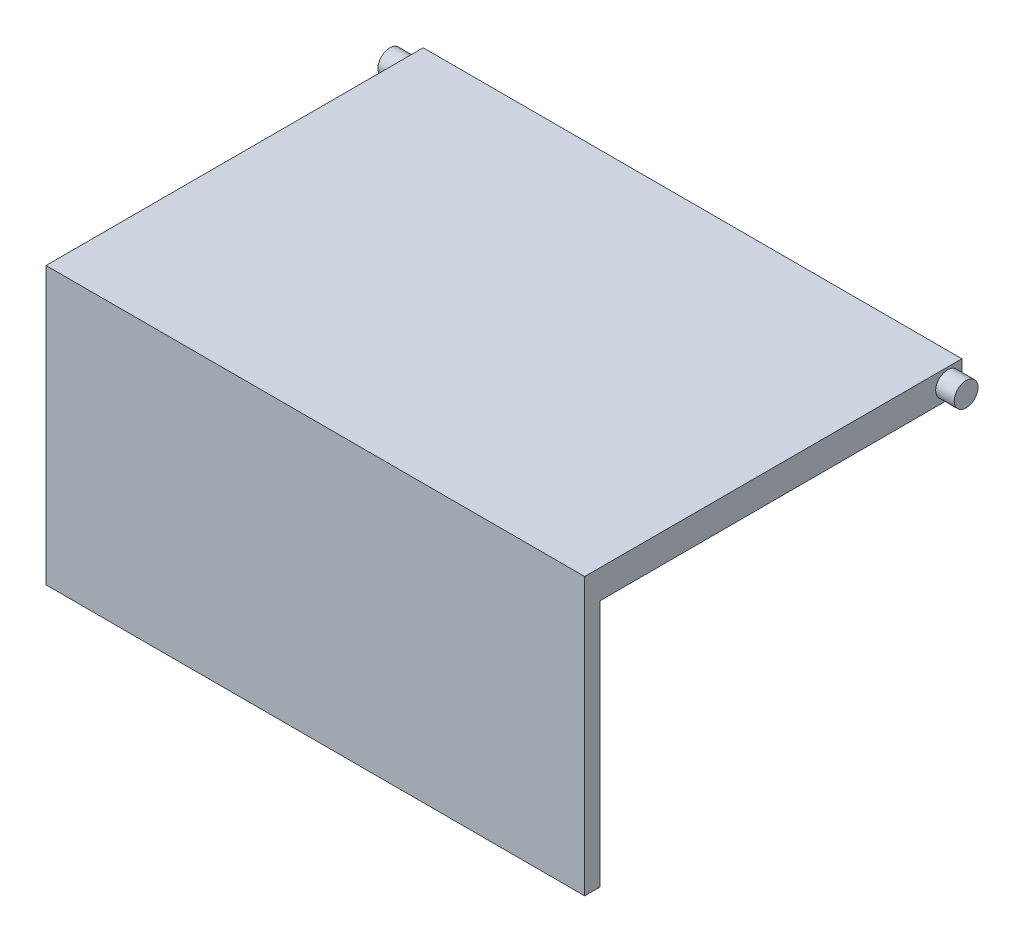
ISO-10303-21;
HEADER;
FILE_DESCRIPTION(('STEP AP214'),'2;1');
FILE_NAME('part.step','',(''),(''),'','','');
FILE_SCHEMA(('AUTOMOTIVE_DESIGN { 1 0 10303 214 1 1 1 1 }'));
ENDSEC;
DATA;
#1=APPLICATION_CONTEXT('core data for automotive mechanical design processes');
#2=APPLICATION_PROTOCOL_DEFINITION('international standard','automotive_design',2000,#1);
#3=PRODUCT_CONTEXT('',#1,'mechanical');
#4=PRODUCT('Part','Part','',(#3));
#5=PRODUCT_RELATED_PRODUCT_CATEGORY('part','',(#4));
#6=PRODUCT_DEFINITION_FORMATION('','',#4);
#7=PRODUCT_DEFINITION_CONTEXT('part definition',#1,'design');
#8=PRODUCT_DEFINITION('design','',#6,#7);
#9=PRODUCT_DEFINITION_SHAPE('','',#8);
#10=(LENGTH_UNIT() NAMED_UNIT(*) SI_UNIT(.MILLI.,.METRE.));
#11=(NAMED_UNIT(*) PLANE_ANGLE_UNIT() SI_UNIT($,.RADIAN.));
#12=(NAMED_UNIT(*) SI_UNIT($,.STERADIAN.) SOLID_ANGLE_UNIT());
#13=UNCERTAINTY_MEASURE_WITH_UNIT(LENGTH_MEASURE(1.E-05),#10,'distance_accuracy_value','');
#14=(GEOMETRIC_REPRESENTATION_CONTEXT(3) GLOBAL_UNCERTAINTY_ASSIGNED_CONTEXT((#13)) GLOBAL_UNIT_ASSIGNED_CONTEXT((#10,
#11,#12)) REPRESENTATION_CONTEXT('',''));
#15=CARTESIAN_POINT('',(0.,0.,0.));
#16=DIRECTION('',(0.,0.,1.));
#17=DIRECTION('',(1.,0.,0.));
#18=AXIS2_PLACEMENT_3D('',#15,#16,#17);
#19=CARTESIAN_POINT('',(-26.3692636072572,5.58057630736393,3.));
#20=DIRECTION('',(1.,0.,0.));
#21=DIRECTION('',(0.,0.,-1.));
#22=AXIS2_PLACEMENT_3D('',#19,#20,#21);
#23=CYLINDRICAL_SURFACE('',#22,2.5);
#24=CARTESIAN_POINT('',(94.6307363927428,5.58057630736393,3.));
#25=DIRECTION('',(-1.,0.,0.));
#26=DIRECTION('',(0.,0.,1.));
#27=AXIS2_PLACEMENT_3D('',#24,#25,#26);
#28=CIRCLE('',#27,2.5);
#29=CARTESIAN_POINT('',(94.6307363927428,5.58057630736393,5.5));
#30=VERTEX_POINT('',#29);
#31=EDGE_CURVE('E146',#30,#30,#28,.T.);
#32=ORIENTED_EDGE('',*,*,#31,.T.);
#33=EDGE_LOOP('',(#32));
#34=FACE_BOUND('',#33,.T.);
#35=CARTESIAN_POINT('',(90.7407363927428,5.58057630736393,3.));
#36=DIRECTION('',(-1.,0.,0.));
#37=DIRECTION('',(0.,0.,1.));
#38=AXIS2_PLACEMENT_3D('',#35,#36,#37);
#39=CIRCLE('',#38,2.5);
#40=CARTESIAN_POINT('',(90.7407363927428,5.58057630736393,5.5));
#41=VERTEX_POINT('',#40);
#42=EDGE_CURVE('E105',#41,#41,#39,.F.);
#43=ORIENTED_EDGE('',*,*,#42,.T.);
#44=EDGE_LOOP('',(#43));
#45=FACE_BOUND('',#44,.T.);
#46=ADVANCED_FACE('F37',(#34,#45),#23,.T.);
#47=CARTESIAN_POINT('',(-22.3692636072572,8.58057630736393,80.));
#48=DIRECTION('',(1.,0.,0.));
#49=DIRECTION('',(0.,0.,-1.));
#50=AXIS2_PLACEMENT_3D('',#47,#48,#49);
#51=PLANE('',#50);
#52=DIRECTION('',(0.,0.,-1.));
#53=VECTOR('',#52,1.);
#54=CARTESIAN_POINT('',(-22.3692636072572,-49.4894236926361,80.));
#55=LINE('',#54,#53);
#56=CARTESIAN_POINT('',(-22.3692636072572,-49.4894236926361,79.2));
#57=VERTEX_POINT('',#56);
#58=CARTESIAN_POINT('',(-22.3692636072572,-49.4894236926361,76.));
#59=VERTEX_POINT('',#58);
#60=EDGE_CURVE('E97',#57,#59,#55,.T.);
#61=ORIENTED_EDGE('',*,*,#60,.F.);
#62=DIRECTION('',(0.,-1.,0.));
#63=VECTOR('',#62,1.);
#64=CARTESIAN_POINT('',(-22.3692636072572,8.58057630736393,79.2));
#65=LINE('',#64,#63);
#66=CARTESIAN_POINT('',(-22.3692636072572,8.58057630736393,79.2));
#67=VERTEX_POINT('',#66);
#68=EDGE_CURVE('E51',#67,#57,#65,.T.);
#69=ORIENTED_EDGE('',*,*,#68,.F.);
#70=DIRECTION('',(0.,0.,-1.));
#71=VECTOR('',#70,1.);
#72=CARTESIAN_POINT('',(-22.3692636072572,8.58057630736393,80.));
#73=LINE('',#72,#71);
#74=CARTESIAN_POINT('',(-22.3692636072572,8.58057630736393,0.));
#75=VERTEX_POINT('',#74);
#76=EDGE_CURVE('E58',#67,#75,#73,.T.);
#77=ORIENTED_EDGE('',*,*,#76,.T.);
#78=DIRECTION('',(0.,-1.,0.));
#79=VECTOR('',#78,1.);
#80=CARTESIAN_POINT('',(-22.3692636072572,8.58057630736393,0.));
#81=LINE('',#80,#79);
#82=CARTESIAN_POINT('',(-22.3692636072572,2.56610996324618,0.));
#83=VERTEX_POINT('',#82);
#84=EDGE_CURVE('E134',#75,#83,#81,.T.);
#85=ORIENTED_EDGE('',*,*,#84,.T.);
#86=DIRECTION('',(0.,0.,-1.));
#87=VECTOR('',#86,1.);
#88=CARTESIAN_POINT('',(-22.3692636072572,2.56610996324618,79.));
#89=LINE('',#88,#87);
#90=CARTESIAN_POINT('',(-22.3692636072572,2.56610996324618,76.));
#91=VERTEX_POINT('',#90);
#92=EDGE_CURVE('E144',#91,#83,#89,.T.);
#93=ORIENTED_EDGE('',*,*,#92,.F.);
#94=DIRECTION('',(0.,1.,0.));
#95=VECTOR('',#94,1.);
#96=CARTESIAN_POINT('',(-22.3692636072572,-49.4894236926361,76.));
#97=LINE('',#96,#95);
#98=EDGE_CURVE('E121',#59,#91,#97,.T.);
#99=ORIENTED_EDGE('',*,*,#98,.F.);
#100=EDGE_LOOP('',(#61,#69,#77,#85,#93,#99));
#101=FACE_BOUND('',#100,.T.);
#102=CARTESIAN_POINT('',(-22.3692636072572,5.58057630736393,3.));
#103=DIRECTION('',(1.,0.,0.));
#104=DIRECTION('',(0.,0.,-1.));
#105=AXIS2_PLACEMENT_3D('',#102,#103,#104);
#106=CIRCLE('',#105,2.5);
#107=CARTESIAN_POINT('',(-22.3692636072572,5.58057630736393,0.5));
#108=VERTEX_POINT('',#107);
#109=EDGE_CURVE('E157',#108,#108,#106,.F.);
#110=ORIENTED_EDGE('',*,*,#109,.F.);
#111=EDGE_LOOP('',(#110));
#112=FACE_BOUND('',#111,.T.);
#113=ADVANCED_FACE('F39',(#101,#112),#51,.F.);
#114=CARTESIAN_POINT('',(90.7407363927428,8.58057630736393,80.));
#115=DIRECTION('',(-1.,0.,0.));
#116=DIRECTION('',(0.,0.,1.));
#117=AXIS2_PLACEMENT_3D('',#114,#115,#116);
#118=PLANE('',#117);
#119=ORIENTED_EDGE('',*,*,#42,.F.);
#120=EDGE_LOOP('',(#119));
#121=FACE_BOUND('',#120,.T.);
#122=DIRECTION('',(0.,0.,-1.));
#123=VECTOR('',#122,1.);
#124=CARTESIAN_POINT('',(90.7407363927428,8.58057630736393,80.));
#125=LINE('',#124,#123);
#126=CARTESIAN_POINT('',(90.7407363927428,8.58057630736393,79.2));
#127=VERTEX_POINT('',#126);
#128=CARTESIAN_POINT('',(90.7407363927428,8.58057630736393,0.));
#129=VERTEX_POINT('',#128);
#130=EDGE_CURVE('E103',#127,#129,#125,.T.);
#131=ORIENTED_EDGE('',*,*,#130,.F.);
#132=DIRECTION('',(0.,-1.,0.));
#133=VECTOR('',#132,1.);
#134=CARTESIAN_POINT('',(90.7407363927428,8.58057630736393,79.2));
#135=LINE('',#134,#133);
#136=CARTESIAN_POINT('',(90.7407363927428,-49.4894236926361,79.2));
#137=VERTEX_POINT('',#136);
#138=EDGE_CURVE('E90',#127,#137,#135,.T.);
#139=ORIENTED_EDGE('',*,*,#138,.T.);
#140=DIRECTION('',(0.,0.,1.));
#141=VECTOR('',#140,1.);
#142=CARTESIAN_POINT('',(90.7407363927428,-49.4894236926361,80.));
#143=LINE('',#142,#141);
#144=CARTESIAN_POINT('',(90.7407363927428,-49.4894236926361,76.));
#145=VERTEX_POINT('',#144);
#146=EDGE_CURVE('E132',#145,#137,#143,.T.);
#147=ORIENTED_EDGE('',*,*,#146,.F.);
#148=DIRECTION('',(0.,1.,0.));
#149=VECTOR('',#148,1.);
#150=CARTESIAN_POINT('',(90.7407363927428,-49.4894236926361,76.));
#151=LINE('',#150,#149);
#152=CARTESIAN_POINT('',(90.7407363927428,2.56610996324618,76.));
#153=VERTEX_POINT('',#152);
#154=EDGE_CURVE('E119',#145,#153,#151,.T.);
#155=ORIENTED_EDGE('',*,*,#154,.T.);
#156=DIRECTION('',(0.,0.,-1.));
#157=VECTOR('',#156,1.);
#158=CARTESIAN_POINT('',(90.7407363927428,2.56610996324618,79.));
#159=LINE('',#158,#157);
#160=CARTESIAN_POINT('',(90.7407363927428,2.56610996324618,0.));
#161=VERTEX_POINT('',#160);
#162=EDGE_CURVE('E129',#153,#161,#159,.T.);
#163=ORIENTED_EDGE('',*,*,#162,.T.);
#164=DIRECTION('',(0.,1.,0.));
#165=VECTOR('',#164,1.);
#166=CARTESIAN_POINT('',(90.7407363927428,8.58057630736393,0.));
#167=LINE('',#166,#165);
#168=EDGE_CURVE('E107',#161,#129,#167,.T.);
#169=ORIENTED_EDGE('',*,*,#168,.T.);
#170=EDGE_LOOP('',(#131,#139,#147,#155,#163,#169));
#171=FACE_BOUND('',#170,.T.);
#172=ADVANCED_FACE('F127',(#121,#171),#118,.F.);
#173=CARTESIAN_POINT('',(-22.3692636072572,8.58057630736393,80.));
#174=DIRECTION('',(0.,-1.,0.));
#175=DIRECTION('',(0.,0.,-1.));
#176=AXIS2_PLACEMENT_3D('',#173,#174,#175);
#177=PLANE('',#176);
#178=ORIENTED_EDGE('',*,*,#76,.F.);
#179=DIRECTION('',(-1.,0.,0.));
#180=VECTOR('',#179,1.);
#181=CARTESIAN_POINT('',(201.630736392743,8.58057630736393,79.2));
#182=LINE('',#181,#180);
#183=EDGE_CURVE('E87',#127,#67,#182,.T.);
#184=ORIENTED_EDGE('',*,*,#183,.F.);
#185=ORIENTED_EDGE('',*,*,#130,.T.);
#186=DIRECTION('',(-1.,0.,0.));
#187=VECTOR('',#186,1.);
#188=CARTESIAN_POINT('',(-22.3692636072572,8.58057630736393,0.));
#189=LINE('',#188,#187);
#190=EDGE_CURVE('E101',#129,#75,#189,.T.);
#191=ORIENTED_EDGE('',*,*,#190,.T.);
#192=EDGE_LOOP('',(#178,#184,#185,#191));
#193=FACE_BOUND('',#192,.T.);
#194=ADVANCED_FACE('F99',(#193),#177,.F.);
#195=CARTESIAN_POINT('',(0.,0.,0.));
#196=DIRECTION('',(0.,0.,1.));
#197=DIRECTION('',(1.,0.,0.));
#198=AXIS2_PLACEMENT_3D('',#195,#196,#197);
#199=PLANE('',#198);
#200=ORIENTED_EDGE('',*,*,#84,.F.);
#201=ORIENTED_EDGE('',*,*,#190,.F.);
#202=ORIENTED_EDGE('',*,*,#168,.F.);
#203=DIRECTION('',(-1.,0.,0.));
#204=VECTOR('',#203,1.);
#205=CARTESIAN_POINT('',(90.7407363927428,2.56610996324618,0.));
#206=LINE('',#205,#204);
#207=EDGE_CURVE('E143',#161,#83,#206,.T.);
#208=ORIENTED_EDGE('',*,*,#207,.T.);
#209=EDGE_LOOP('',(#200,#201,#202,#208));
#210=FACE_BOUND('',#209,.T.);
#211=ADVANCED_FACE('F142',(#210),#199,.F.);
#212=CARTESIAN_POINT('',(-22.3692636072572,-49.4894236926361,76.));
#213=DIRECTION('',(0.,0.,1.));
#214=DIRECTION('',(1.,0.,0.));
#215=AXIS2_PLACEMENT_3D('',#212,#213,#214);
#216=PLANE('',#215);
#217=ORIENTED_EDGE('',*,*,#98,.T.);
#218=DIRECTION('',(1.,0.,0.));
#219=VECTOR('',#218,1.);
#220=CARTESIAN_POINT('',(-22.3692636072572,2.56610996324618,76.));
#221=LINE('',#220,#219);
#222=EDGE_CURVE('E45',#91,#153,#221,.T.);
#223=ORIENTED_EDGE('',*,*,#222,.T.);
#224=ORIENTED_EDGE('',*,*,#154,.F.);
#225=DIRECTION('',(1.,0.,0.));
#226=VECTOR('',#225,1.);
#227=CARTESIAN_POINT('',(-22.3692636072572,-49.4894236926361,76.));
#228=LINE('',#227,#226);
#229=EDGE_CURVE('E136',#59,#145,#228,.T.);
#230=ORIENTED_EDGE('',*,*,#229,.F.);
#231=EDGE_LOOP('',(#217,#223,#224,#230));
#232=FACE_BOUND('',#231,.T.);
#233=ADVANCED_FACE('F117',(#232),#216,.F.);
#234=CARTESIAN_POINT('',(0.,-49.4894236926361,0.));
#235=DIRECTION('',(0.,-1.,0.));
#236=DIRECTION('',(0.,0.,-1.));
#237=AXIS2_PLACEMENT_3D('',#234,#235,#236);
#238=PLANE('',#237);
#239=DIRECTION('',(1.,0.,0.));
#240=VECTOR('',#239,1.);
#241=CARTESIAN_POINT('',(0.,-49.4894236926361,79.2));
#242=LINE('',#241,#240);
#243=EDGE_CURVE('E11',#57,#137,#242,.T.);
#244=ORIENTED_EDGE('',*,*,#243,.F.);
#245=ORIENTED_EDGE('',*,*,#60,.T.);
#246=ORIENTED_EDGE('',*,*,#229,.T.);
#247=ORIENTED_EDGE('',*,*,#146,.T.);
#248=EDGE_LOOP('',(#244,#245,#246,#247));
#249=FACE_BOUND('',#248,.T.);
#250=ADVANCED_FACE('F161',(#249),#238,.T.);
#251=CARTESIAN_POINT('',(-26.3692636072572,5.58057630736393,3.));
#252=DIRECTION('',(-1.,0.,0.));
#253=DIRECTION('',(0.,0.,1.));
#254=AXIS2_PLACEMENT_3D('',#251,#252,#253);
#255=CIRCLE('',#254,2.5);
#256=CARTESIAN_POINT('',(-26.3692636072572,5.58057630736393,5.5));
#257=VERTEX_POINT('',#256);
#258=EDGE_CURVE('E149',#257,#257,#255,.T.);
#259=ORIENTED_EDGE('',*,*,#258,.F.);
#260=EDGE_LOOP('',(#259));
#261=FACE_BOUND('',#260,.T.);
#262=ORIENTED_EDGE('',*,*,#109,.T.);
#263=EDGE_LOOP('',(#262));
#264=FACE_BOUND('',#263,.T.);
#265=ADVANCED_FACE('F163',(#261,#264),#23,.T.);
#266=CARTESIAN_POINT('',(-26.3692636072572,5.58057630736393,3.));
#267=DIRECTION('',(-1.,0.,0.));
#268=DIRECTION('',(0.,0.,1.));
#269=AXIS2_PLACEMENT_3D('',#266,#267,#268);
#270=PLANE('',#269);
#271=ORIENTED_EDGE('',*,*,#258,.T.);
#272=EDGE_LOOP('',(#271));
#273=FACE_BOUND('',#272,.T.);
#274=ADVANCED_FACE('F169',(#273),#270,.T.);
#275=CARTESIAN_POINT('',(94.6307363927428,5.58057630736393,3.));
#276=DIRECTION('',(-1.,0.,0.));
#277=DIRECTION('',(0.,0.,1.));
#278=AXIS2_PLACEMENT_3D('',#275,#276,#277);
#279=PLANE('',#278);
#280=ORIENTED_EDGE('',*,*,#31,.F.);
#281=EDGE_LOOP('',(#280));
#282=FACE_BOUND('',#281,.T.);
#283=ADVANCED_FACE('F182',(#282),#279,.F.);
#284=CARTESIAN_POINT('',(90.7407363927428,2.56610996324618,79.));
#285=DIRECTION('',(0.,-1.,0.));
#286=DIRECTION('',(0.,0.,-1.));
#287=AXIS2_PLACEMENT_3D('',#284,#285,#286);
#288=PLANE('',#287);
#289=ORIENTED_EDGE('',*,*,#222,.F.);
#290=ORIENTED_EDGE('',*,*,#92,.T.);
#291=ORIENTED_EDGE('',*,*,#207,.F.);
#292=ORIENTED_EDGE('',*,*,#162,.F.);
#293=EDGE_LOOP('',(#289,#290,#291,#292));
#294=FACE_BOUND('',#293,.T.);
#295=ADVANCED_FACE('F145',(#294),#288,.T.);
#296=CARTESIAN_POINT('',(201.630736392743,8.58057630736393,79.2));
#297=DIRECTION('',(0.,0.,-1.));
#298=DIRECTION('',(-1.,0.,0.));
#299=AXIS2_PLACEMENT_3D('',#296,#297,#298);
#300=PLANE('',#299);
#301=ORIENTED_EDGE('',*,*,#183,.T.);
#302=ORIENTED_EDGE('',*,*,#68,.T.);
#303=ORIENTED_EDGE('',*,*,#243,.T.);
#304=ORIENTED_EDGE('',*,*,#138,.F.);
#305=EDGE_LOOP('',(#301,#302,#303,#304));
#306=FACE_BOUND('',#305,.T.);
#307=ADVANCED_FACE('F88',(#306),#300,.F.);
#308=CLOSED_SHELL('',(#46,#113,#172,#194,#211,#233,#250,#265,#274,#283,#295,#307));
#309=MANIFOLD_SOLID_BREP('B2',#308);
#310=ADVANCED_BREP_SHAPE_REPRESENTATION('',(#18,#309),#14);
#311=SHAPE_DEFINITION_REPRESENTATION(#9,#310);
ENDSEC;
END-ISO-10303-21;
